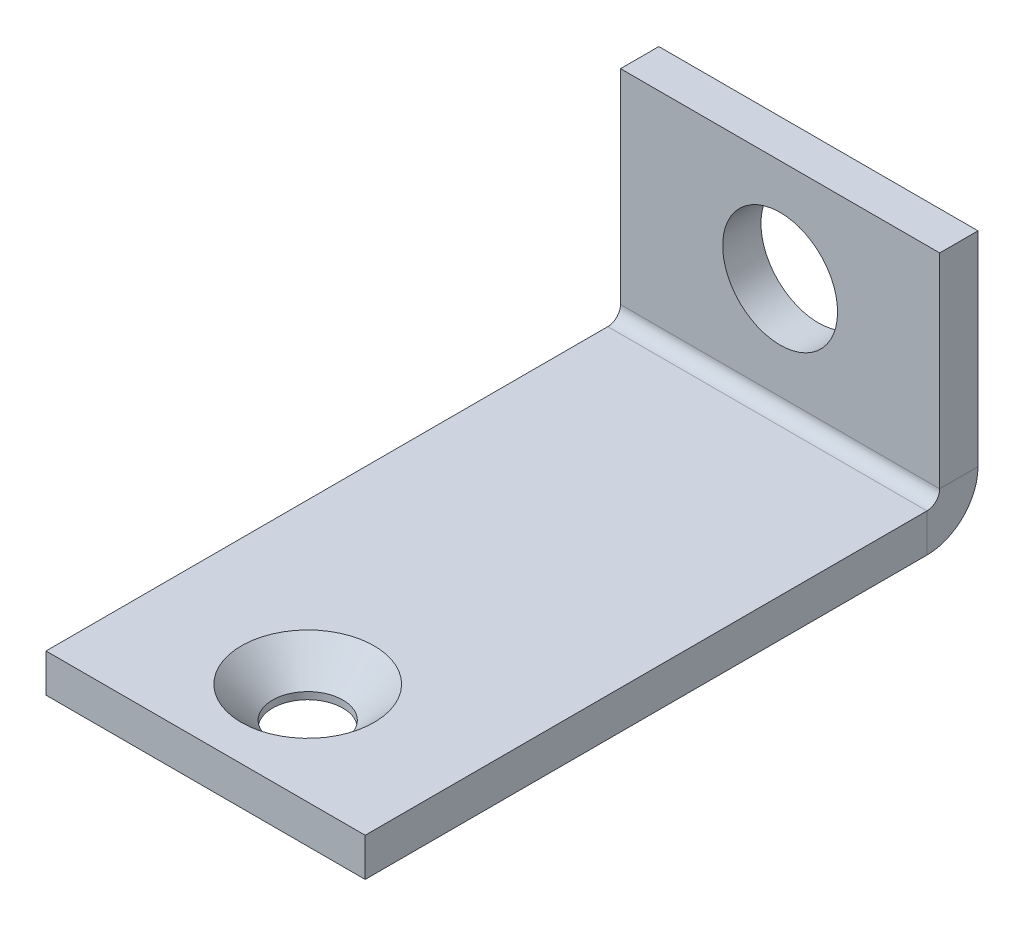
ISO-10303-21;
HEADER;
FILE_DESCRIPTION(('STEP AP214'),'2;1');
FILE_NAME('part.step','',(''),(''),'','','');
FILE_SCHEMA(('AUTOMOTIVE_DESIGN { 1 0 10303 214 1 1 1 1 }'));
ENDSEC;
DATA;
#1=APPLICATION_CONTEXT('core data for automotive mechanical design processes');
#2=APPLICATION_PROTOCOL_DEFINITION('international standard','automotive_design',2000,#1);
#3=PRODUCT_CONTEXT('',#1,'mechanical');
#4=PRODUCT('Part','Part','',(#3));
#5=PRODUCT_RELATED_PRODUCT_CATEGORY('part','',(#4));
#6=PRODUCT_DEFINITION_FORMATION('','',#4);
#7=PRODUCT_DEFINITION_CONTEXT('part definition',#1,'design');
#8=PRODUCT_DEFINITION('design','',#6,#7);
#9=PRODUCT_DEFINITION_SHAPE('','',#8);
#10=(LENGTH_UNIT() NAMED_UNIT(*) SI_UNIT(.MILLI.,.METRE.));
#11=(NAMED_UNIT(*) PLANE_ANGLE_UNIT() SI_UNIT($,.RADIAN.));
#12=(NAMED_UNIT(*) SI_UNIT($,.STERADIAN.) SOLID_ANGLE_UNIT());
#13=UNCERTAINTY_MEASURE_WITH_UNIT(LENGTH_MEASURE(1.E-05),#10,'distance_accuracy_value','');
#14=(GEOMETRIC_REPRESENTATION_CONTEXT(3) GLOBAL_UNCERTAINTY_ASSIGNED_CONTEXT((#13)) GLOBAL_UNIT_ASSIGNED_CONTEXT((#10,
#11,#12)) REPRESENTATION_CONTEXT('',''));
#15=CARTESIAN_POINT('',(0.,0.,0.));
#16=DIRECTION('',(0.,0.,1.));
#17=DIRECTION('',(1.,0.,0.));
#18=AXIS2_PLACEMENT_3D('',#15,#16,#17);
#19=CARTESIAN_POINT('',(25.,0.,4.));
#20=DIRECTION('',(1.,0.,0.));
#21=DIRECTION('',(0.,0.,-1.));
#22=AXIS2_PLACEMENT_3D('',#19,#20,#21);
#23=PLANE('',#22);
#24=DIRECTION('',(0.,1.,0.));
#25=VECTOR('',#24,1.);
#26=CARTESIAN_POINT('',(25.,0.,4.));
#27=LINE('',#26,#25);
#28=CARTESIAN_POINT('',(25.,0.,4.));
#29=VERTEX_POINT('',#28);
#30=CARTESIAN_POINT('',(25.,3.,4.));
#31=VERTEX_POINT('',#30);
#32=EDGE_CURVE('E13',#29,#31,#27,.T.);
#33=ORIENTED_EDGE('',*,*,#32,.F.);
#34=CARTESIAN_POINT('',(25.,4.,4.));
#35=DIRECTION('',(-1.,0.,0.));
#36=DIRECTION('',(0.,0.,1.));
#37=AXIS2_PLACEMENT_3D('',#34,#35,#36);
#38=CIRCLE('',#37,4.);
#39=CARTESIAN_POINT('',(25.,4.,0.));
#40=VERTEX_POINT('',#39);
#41=EDGE_CURVE('E140',#29,#40,#38,.F.);
#42=ORIENTED_EDGE('',*,*,#41,.T.);
#43=DIRECTION('',(0.,0.,-1.));
#44=VECTOR('',#43,1.);
#45=CARTESIAN_POINT('',(25.,4.,3.));
#46=LINE('',#45,#44);
#47=CARTESIAN_POINT('',(25.,4.,3.));
#48=VERTEX_POINT('',#47);
#49=EDGE_CURVE('E58',#48,#40,#46,.T.);
#50=ORIENTED_EDGE('',*,*,#49,.F.);
#51=CARTESIAN_POINT('',(25.,4.,4.));
#52=DIRECTION('',(1.,0.,0.));
#53=DIRECTION('',(0.,0.,-1.));
#54=AXIS2_PLACEMENT_3D('',#51,#52,#53);
#55=CIRCLE('',#54,1.);
#56=EDGE_CURVE('E147',#31,#48,#55,.T.);
#57=ORIENTED_EDGE('',*,*,#56,.F.);
#58=EDGE_LOOP('',(#33,#42,#50,#57));
#59=FACE_BOUND('',#58,.T.);
#60=ADVANCED_FACE('F50',(#59),#23,.T.);
#61=CARTESIAN_POINT('',(25.,4.,3.));
#62=DIRECTION('',(1.,0.,0.));
#63=DIRECTION('',(0.,0.,-1.));
#64=AXIS2_PLACEMENT_3D('',#61,#62,#63);
#65=PLANE('',#64);
#66=DIRECTION('',(0.,0.,-1.));
#67=VECTOR('',#66,1.);
#68=CARTESIAN_POINT('',(25.,0.,0.));
#69=LINE('',#68,#67);
#70=CARTESIAN_POINT('',(25.,0.,48.));
#71=VERTEX_POINT('',#70);
#72=EDGE_CURVE('E135',#71,#29,#69,.T.);
#73=ORIENTED_EDGE('',*,*,#72,.T.);
#74=ORIENTED_EDGE('',*,*,#32,.T.);
#75=DIRECTION('',(0.,0.,-1.));
#76=VECTOR('',#75,1.);
#77=CARTESIAN_POINT('',(25.,3.,0.));
#78=LINE('',#77,#76);
#79=CARTESIAN_POINT('',(25.,2.99999999999998,48.));
#80=VERTEX_POINT('',#79);
#81=EDGE_CURVE('E145',#80,#31,#78,.T.);
#82=ORIENTED_EDGE('',*,*,#81,.F.);
#83=DIRECTION('',(0.,1.,0.));
#84=VECTOR('',#83,1.);
#85=CARTESIAN_POINT('',(25.,0.,48.));
#86=LINE('',#85,#84);
#87=EDGE_CURVE('E126',#71,#80,#86,.T.);
#88=ORIENTED_EDGE('',*,*,#87,.F.);
#89=EDGE_LOOP('',(#73,#74,#82,#88));
#90=FACE_BOUND('',#89,.T.);
#91=ADVANCED_FACE('F143',(#90),#65,.T.);
#92=CARTESIAN_POINT('',(0.,4.,0.));
#93=DIRECTION('',(-1.,0.,0.));
#94=DIRECTION('',(0.,0.,1.));
#95=AXIS2_PLACEMENT_3D('',#92,#93,#94);
#96=PLANE('',#95);
#97=DIRECTION('',(0.,0.,1.));
#98=VECTOR('',#97,1.);
#99=CARTESIAN_POINT('',(0.,4.,0.));
#100=LINE('',#99,#98);
#101=CARTESIAN_POINT('',(0.,4.,0.));
#102=VERTEX_POINT('',#101);
#103=CARTESIAN_POINT('',(0.,4.,3.));
#104=VERTEX_POINT('',#103);
#105=EDGE_CURVE('E101',#102,#104,#100,.T.);
#106=ORIENTED_EDGE('',*,*,#105,.F.);
#107=CARTESIAN_POINT('',(0.,4.,4.));
#108=DIRECTION('',(-1.,0.,0.));
#109=DIRECTION('',(0.,0.,1.));
#110=AXIS2_PLACEMENT_3D('',#107,#108,#109);
#111=CIRCLE('',#110,4.);
#112=CARTESIAN_POINT('',(0.,0.,4.));
#113=VERTEX_POINT('',#112);
#114=EDGE_CURVE('E170',#113,#102,#111,.F.);
#115=ORIENTED_EDGE('',*,*,#114,.F.);
#116=DIRECTION('',(0.,-1.,0.));
#117=VECTOR('',#116,1.);
#118=CARTESIAN_POINT('',(0.,3.,4.));
#119=LINE('',#118,#117);
#120=CARTESIAN_POINT('',(0.,3.,4.));
#121=VERTEX_POINT('',#120);
#122=EDGE_CURVE('E94',#121,#113,#119,.T.);
#123=ORIENTED_EDGE('',*,*,#122,.F.);
#124=CARTESIAN_POINT('',(0.,4.,4.));
#125=DIRECTION('',(1.,0.,0.));
#126=DIRECTION('',(0.,0.,-1.));
#127=AXIS2_PLACEMENT_3D('',#124,#125,#126);
#128=CIRCLE('',#127,1.);
#129=EDGE_CURVE('E163',#121,#104,#128,.T.);
#130=ORIENTED_EDGE('',*,*,#129,.T.);
#131=EDGE_LOOP('',(#106,#115,#123,#130));
#132=FACE_BOUND('',#131,.T.);
#133=ADVANCED_FACE('F202',(#132),#96,.T.);
#134=CARTESIAN_POINT('',(0.,3.,4.));
#135=DIRECTION('',(-1.,0.,0.));
#136=DIRECTION('',(0.,0.,1.));
#137=AXIS2_PLACEMENT_3D('',#134,#135,#136);
#138=PLANE('',#137);
#139=DIRECTION('',(0.,1.,0.));
#140=VECTOR('',#139,1.);
#141=CARTESIAN_POINT('',(0.,0.,0.));
#142=LINE('',#141,#140);
#143=CARTESIAN_POINT('',(0.,20.,0.));
#144=VERTEX_POINT('',#143);
#145=EDGE_CURVE('E153',#102,#144,#142,.T.);
#146=ORIENTED_EDGE('',*,*,#145,.F.);
#147=ORIENTED_EDGE('',*,*,#105,.T.);
#148=DIRECTION('',(0.,1.,0.));
#149=VECTOR('',#148,1.);
#150=CARTESIAN_POINT('',(0.,0.,3.));
#151=LINE('',#150,#149);
#152=CARTESIAN_POINT('',(0.,20.,3.));
#153=VERTEX_POINT('',#152);
#154=EDGE_CURVE('E160',#104,#153,#151,.T.);
#155=ORIENTED_EDGE('',*,*,#154,.T.);
#156=DIRECTION('',(0.,0.,-1.));
#157=VECTOR('',#156,1.);
#158=CARTESIAN_POINT('',(0.,20.,3.));
#159=LINE('',#158,#157);
#160=EDGE_CURVE('E156',#153,#144,#159,.T.);
#161=ORIENTED_EDGE('',*,*,#160,.T.);
#162=EDGE_LOOP('',(#146,#147,#155,#161));
#163=FACE_BOUND('',#162,.T.);
#164=ADVANCED_FACE('F189',(#163),#138,.T.);
#165=CARTESIAN_POINT('',(25.,0.,0.));
#166=DIRECTION('',(0.,0.,1.));
#167=DIRECTION('',(1.,0.,0.));
#168=AXIS2_PLACEMENT_3D('',#165,#166,#167);
#169=PLANE('',#168);
#170=CARTESIAN_POINT('',(12.5,12.,0.));
#171=DIRECTION('',(0.,0.,1.));
#172=DIRECTION('',(1.,0.,0.));
#173=AXIS2_PLACEMENT_3D('',#170,#171,#172);
#174=CIRCLE('',#173,4.5);
#175=CARTESIAN_POINT('',(17.,12.,0.));
#176=VERTEX_POINT('',#175);
#177=EDGE_CURVE('E222',#176,#176,#174,.T.);
#178=ORIENTED_EDGE('',*,*,#177,.T.);
#179=EDGE_LOOP('',(#178));
#180=FACE_BOUND('',#179,.T.);
#181=ORIENTED_EDGE('',*,*,#145,.T.);
#182=DIRECTION('',(-1.,0.,0.));
#183=VECTOR('',#182,1.);
#184=CARTESIAN_POINT('',(25.,20.,0.));
#185=LINE('',#184,#183);
#186=CARTESIAN_POINT('',(25.,20.,0.));
#187=VERTEX_POINT('',#186);
#188=EDGE_CURVE('E184',#187,#144,#185,.T.);
#189=ORIENTED_EDGE('',*,*,#188,.F.);
#190=DIRECTION('',(0.,1.,0.));
#191=VECTOR('',#190,1.);
#192=CARTESIAN_POINT('',(25.,0.,0.));
#193=LINE('',#192,#191);
#194=EDGE_CURVE('E107',#40,#187,#193,.T.);
#195=ORIENTED_EDGE('',*,*,#194,.F.);
#196=DIRECTION('',(-1.,0.,0.));
#197=VECTOR('',#196,1.);
#198=CARTESIAN_POINT('',(25.,4.,0.));
#199=LINE('',#198,#197);
#200=EDGE_CURVE('E152',#40,#102,#199,.T.);
#201=ORIENTED_EDGE('',*,*,#200,.T.);
#202=EDGE_LOOP('',(#181,#189,#195,#201));
#203=FACE_BOUND('',#202,.T.);
#204=ADVANCED_FACE('F239',(#180,#203),#169,.F.);
#205=CARTESIAN_POINT('',(25.,20.,3.));
#206=DIRECTION('',(0.,1.,0.));
#207=DIRECTION('',(0.,0.,1.));
#208=AXIS2_PLACEMENT_3D('',#205,#206,#207);
#209=PLANE('',#208);
#210=ORIENTED_EDGE('',*,*,#160,.F.);
#211=DIRECTION('',(-1.,0.,0.));
#212=VECTOR('',#211,1.);
#213=CARTESIAN_POINT('',(25.,20.,3.));
#214=LINE('',#213,#212);
#215=CARTESIAN_POINT('',(25.,20.,3.));
#216=VERTEX_POINT('',#215);
#217=EDGE_CURVE('E182',#216,#153,#214,.T.);
#218=ORIENTED_EDGE('',*,*,#217,.F.);
#219=DIRECTION('',(0.,0.,-1.));
#220=VECTOR('',#219,1.);
#221=CARTESIAN_POINT('',(25.,20.,3.));
#222=LINE('',#221,#220);
#223=EDGE_CURVE('E208',#216,#187,#222,.T.);
#224=ORIENTED_EDGE('',*,*,#223,.T.);
#225=ORIENTED_EDGE('',*,*,#188,.T.);
#226=EDGE_LOOP('',(#210,#218,#224,#225));
#227=FACE_BOUND('',#226,.T.);
#228=ADVANCED_FACE('F232',(#227),#209,.T.);
#229=CARTESIAN_POINT('',(25.,0.,3.));
#230=DIRECTION('',(0.,0.,1.));
#231=DIRECTION('',(1.,0.,0.));
#232=AXIS2_PLACEMENT_3D('',#229,#230,#231);
#233=PLANE('',#232);
#234=CARTESIAN_POINT('',(12.5,12.,3.));
#235=DIRECTION('',(0.,0.,1.));
#236=DIRECTION('',(1.,0.,0.));
#237=AXIS2_PLACEMENT_3D('',#234,#235,#236);
#238=CIRCLE('',#237,4.5);
#239=CARTESIAN_POINT('',(17.,12.,3.));
#240=VERTEX_POINT('',#239);
#241=EDGE_CURVE('E225',#240,#240,#238,.T.);
#242=ORIENTED_EDGE('',*,*,#241,.F.);
#243=EDGE_LOOP('',(#242));
#244=FACE_BOUND('',#243,.T.);
#245=ORIENTED_EDGE('',*,*,#154,.F.);
#246=DIRECTION('',(-1.,0.,0.));
#247=VECTOR('',#246,1.);
#248=CARTESIAN_POINT('',(25.,4.,3.));
#249=LINE('',#248,#247);
#250=EDGE_CURVE('E179',#48,#104,#249,.T.);
#251=ORIENTED_EDGE('',*,*,#250,.F.);
#252=DIRECTION('',(0.,1.,0.));
#253=VECTOR('',#252,1.);
#254=CARTESIAN_POINT('',(25.,0.,3.));
#255=LINE('',#254,#253);
#256=EDGE_CURVE('E207',#48,#216,#255,.T.);
#257=ORIENTED_EDGE('',*,*,#256,.T.);
#258=ORIENTED_EDGE('',*,*,#217,.T.);
#259=EDGE_LOOP('',(#245,#251,#257,#258));
#260=FACE_BOUND('',#259,.T.);
#261=ADVANCED_FACE('F200',(#244,#260),#233,.T.);
#262=CARTESIAN_POINT('',(25.,4.,4.));
#263=DIRECTION('',(-1.,0.,0.));
#264=DIRECTION('',(0.,0.,1.));
#265=AXIS2_PLACEMENT_3D('',#262,#263,#264);
#266=CYLINDRICAL_SURFACE('',#265,1.);
#267=ORIENTED_EDGE('',*,*,#129,.F.);
#268=DIRECTION('',(-1.,0.,0.));
#269=VECTOR('',#268,1.);
#270=CARTESIAN_POINT('',(25.,3.,4.));
#271=LINE('',#270,#269);
#272=EDGE_CURVE('E176',#31,#121,#271,.T.);
#273=ORIENTED_EDGE('',*,*,#272,.F.);
#274=ORIENTED_EDGE('',*,*,#56,.T.);
#275=ORIENTED_EDGE('',*,*,#250,.T.);
#276=EDGE_LOOP('',(#267,#273,#274,#275));
#277=FACE_BOUND('',#276,.T.);
#278=ADVANCED_FACE('F195',(#277),#266,.F.);
#279=CARTESIAN_POINT('',(25.,3.,0.));
#280=DIRECTION('',(0.,1.,0.));
#281=DIRECTION('',(0.,0.,1.));
#282=AXIS2_PLACEMENT_3D('',#279,#280,#281);
#283=PLANE('',#282);
#284=CARTESIAN_POINT('',(12.5,3.,40.));
#285=DIRECTION('',(0.,1.,0.));
#286=DIRECTION('',(0.,0.,1.));
#287=AXIS2_PLACEMENT_3D('',#284,#285,#286);
#288=CIRCLE('',#287,5.2);
#289=CARTESIAN_POINT('',(12.5,3.,45.2));
#290=VERTEX_POINT('',#289);
#291=EDGE_CURVE('E219',#290,#290,#288,.T.);
#292=ORIENTED_EDGE('',*,*,#291,.F.);
#293=EDGE_LOOP('',(#292));
#294=FACE_BOUND('',#293,.T.);
#295=DIRECTION('',(0.,0.,-1.));
#296=VECTOR('',#295,1.);
#297=CARTESIAN_POINT('',(0.,3.,0.));
#298=LINE('',#297,#296);
#299=CARTESIAN_POINT('',(0.,2.99999999999998,48.));
#300=VERTEX_POINT('',#299);
#301=EDGE_CURVE('E165',#300,#121,#298,.T.);
#302=ORIENTED_EDGE('',*,*,#301,.F.);
#303=DIRECTION('',(-1.,0.,0.));
#304=VECTOR('',#303,1.);
#305=CARTESIAN_POINT('',(25.,2.99999999999998,48.));
#306=LINE('',#305,#304);
#307=EDGE_CURVE('E130',#80,#300,#306,.T.);
#308=ORIENTED_EDGE('',*,*,#307,.F.);
#309=ORIENTED_EDGE('',*,*,#81,.T.);
#310=ORIENTED_EDGE('',*,*,#272,.T.);
#311=EDGE_LOOP('',(#302,#308,#309,#310));
#312=FACE_BOUND('',#311,.T.);
#313=ADVANCED_FACE('F205',(#294,#312),#283,.T.);
#314=CARTESIAN_POINT('',(25.,0.,48.));
#315=DIRECTION('',(0.,0.,1.));
#316=DIRECTION('',(1.,0.,0.));
#317=AXIS2_PLACEMENT_3D('',#314,#315,#316);
#318=PLANE('',#317);
#319=DIRECTION('',(0.,1.,0.));
#320=VECTOR('',#319,1.);
#321=CARTESIAN_POINT('',(0.,0.,48.));
#322=LINE('',#321,#320);
#323=CARTESIAN_POINT('',(0.,0.,48.));
#324=VERTEX_POINT('',#323);
#325=EDGE_CURVE('E128',#324,#300,#322,.T.);
#326=ORIENTED_EDGE('',*,*,#325,.F.);
#327=DIRECTION('',(-1.,0.,0.));
#328=VECTOR('',#327,1.);
#329=CARTESIAN_POINT('',(25.,0.,48.));
#330=LINE('',#329,#328);
#331=EDGE_CURVE('E122',#71,#324,#330,.T.);
#332=ORIENTED_EDGE('',*,*,#331,.F.);
#333=ORIENTED_EDGE('',*,*,#87,.T.);
#334=ORIENTED_EDGE('',*,*,#307,.T.);
#335=EDGE_LOOP('',(#326,#332,#333,#334));
#336=FACE_BOUND('',#335,.T.);
#337=ADVANCED_FACE('F124',(#336),#318,.T.);
#338=CARTESIAN_POINT('',(25.,0.,0.));
#339=DIRECTION('',(0.,1.,0.));
#340=DIRECTION('',(0.,0.,1.));
#341=AXIS2_PLACEMENT_3D('',#338,#339,#340);
#342=PLANE('',#341);
#343=CARTESIAN_POINT('',(12.5,0.,40.));
#344=DIRECTION('',(0.,1.,0.));
#345=DIRECTION('',(0.,0.,1.));
#346=AXIS2_PLACEMENT_3D('',#343,#344,#345);
#347=CIRCLE('',#346,2.75);
#348=CARTESIAN_POINT('',(12.5,0.,42.75));
#349=VERTEX_POINT('',#348);
#350=EDGE_CURVE('E157',#349,#349,#347,.T.);
#351=ORIENTED_EDGE('',*,*,#350,.T.);
#352=EDGE_LOOP('',(#351));
#353=FACE_BOUND('',#352,.T.);
#354=DIRECTION('',(0.,0.,-1.));
#355=VECTOR('',#354,1.);
#356=CARTESIAN_POINT('',(0.,0.,0.));
#357=LINE('',#356,#355);
#358=EDGE_CURVE('E168',#324,#113,#357,.T.);
#359=ORIENTED_EDGE('',*,*,#358,.T.);
#360=DIRECTION('',(-1.,0.,0.));
#361=VECTOR('',#360,1.);
#362=CARTESIAN_POINT('',(25.,0.,4.));
#363=LINE('',#362,#361);
#364=EDGE_CURVE('E131',#29,#113,#363,.T.);
#365=ORIENTED_EDGE('',*,*,#364,.F.);
#366=ORIENTED_EDGE('',*,*,#72,.F.);
#367=ORIENTED_EDGE('',*,*,#331,.T.);
#368=EDGE_LOOP('',(#359,#365,#366,#367));
#369=FACE_BOUND('',#368,.T.);
#370=ADVANCED_FACE('F136',(#353,#369),#342,.F.);
#371=CARTESIAN_POINT('',(25.,4.,4.));
#372=DIRECTION('',(-1.,0.,0.));
#373=DIRECTION('',(0.,0.,1.));
#374=AXIS2_PLACEMENT_3D('',#371,#372,#373);
#375=CYLINDRICAL_SURFACE('',#374,4.);
#376=ORIENTED_EDGE('',*,*,#114,.T.);
#377=ORIENTED_EDGE('',*,*,#200,.F.);
#378=ORIENTED_EDGE('',*,*,#41,.F.);
#379=ORIENTED_EDGE('',*,*,#364,.T.);
#380=EDGE_LOOP('',(#376,#377,#378,#379));
#381=FACE_BOUND('',#380,.T.);
#382=ADVANCED_FACE('F263',(#381),#375,.T.);
#383=CARTESIAN_POINT('',(25.,4.,4.));
#384=DIRECTION('',(1.,0.,0.));
#385=DIRECTION('',(0.,0.,-1.));
#386=AXIS2_PLACEMENT_3D('',#383,#384,#385);
#387=PLANE('',#386);
#388=ORIENTED_EDGE('',*,*,#194,.T.);
#389=ORIENTED_EDGE('',*,*,#223,.F.);
#390=ORIENTED_EDGE('',*,*,#256,.F.);
#391=ORIENTED_EDGE('',*,*,#49,.T.);
#392=EDGE_LOOP('',(#388,#389,#390,#391));
#393=FACE_BOUND('',#392,.T.);
#394=ADVANCED_FACE('F260',(#393),#387,.T.);
#395=CARTESIAN_POINT('',(0.,4.,4.));
#396=DIRECTION('',(1.,0.,0.));
#397=DIRECTION('',(0.,0.,-1.));
#398=AXIS2_PLACEMENT_3D('',#395,#396,#397);
#399=PLANE('',#398);
#400=ORIENTED_EDGE('',*,*,#301,.T.);
#401=ORIENTED_EDGE('',*,*,#122,.T.);
#402=ORIENTED_EDGE('',*,*,#358,.F.);
#403=ORIENTED_EDGE('',*,*,#325,.T.);
#404=EDGE_LOOP('',(#400,#401,#402,#403));
#405=FACE_BOUND('',#404,.T.);
#406=ADVANCED_FACE('F262',(#405),#399,.F.);
#407=CARTESIAN_POINT('',(12.5,3.,40.));
#408=DIRECTION('',(0.,1.,0.));
#409=DIRECTION('',(0.,0.,1.));
#410=AXIS2_PLACEMENT_3D('',#407,#408,#409);
#411=CYLINDRICAL_SURFACE('',#410,2.75);
#412=ORIENTED_EDGE('',*,*,#350,.F.);
#413=EDGE_LOOP('',(#412));
#414=FACE_BOUND('',#413,.T.);
#415=CARTESIAN_POINT('',(12.5,0.549999999999995,40.));
#416=DIRECTION('',(0.,1.,0.));
#417=DIRECTION('',(0.,0.,1.));
#418=AXIS2_PLACEMENT_3D('',#415,#416,#417);
#419=CIRCLE('',#418,2.75);
#420=CARTESIAN_POINT('',(12.5,0.549999999999995,42.75));
#421=VERTEX_POINT('',#420);
#422=EDGE_CURVE('E216',#421,#421,#419,.T.);
#423=ORIENTED_EDGE('',*,*,#422,.T.);
#424=EDGE_LOOP('',(#423));
#425=FACE_BOUND('',#424,.T.);
#426=ADVANCED_FACE('F269',(#414,#425),#411,.F.);
#427=CARTESIAN_POINT('',(12.5,3.,40.));
#428=DIRECTION('',(0.,1.,0.));
#429=DIRECTION('',(0.,0.,1.));
#430=AXIS2_PLACEMENT_3D('',#427,#428,#429);
#431=CONICAL_SURFACE('',#430,5.2,0.785398163397448);
#432=ORIENTED_EDGE('',*,*,#422,.F.);
#433=EDGE_LOOP('',(#432));
#434=FACE_BOUND('',#433,.T.);
#435=ORIENTED_EDGE('',*,*,#291,.T.);
#436=EDGE_LOOP('',(#435));
#437=FACE_BOUND('',#436,.T.);
#438=ADVANCED_FACE('F287',(#434,#437),#431,.F.);
#439=CARTESIAN_POINT('',(12.5,12.,3.));
#440=DIRECTION('',(0.,0.,1.));
#441=DIRECTION('',(1.,0.,0.));
#442=AXIS2_PLACEMENT_3D('',#439,#440,#441);
#443=CYLINDRICAL_SURFACE('',#442,4.5);
#444=ORIENTED_EDGE('',*,*,#177,.F.);
#445=EDGE_LOOP('',(#444));
#446=FACE_BOUND('',#445,.T.);
#447=ORIENTED_EDGE('',*,*,#241,.T.);
#448=EDGE_LOOP('',(#447));
#449=FACE_BOUND('',#448,.T.);
#450=ADVANCED_FACE('F229',(#446,#449),#443,.F.);
#451=CLOSED_SHELL('',(#60,#91,#133,#164,#204,#228,#261,#278,#313,#337,#370,#382,#394,#406,#426,
#438,#450));
#452=MANIFOLD_SOLID_BREP('B2',#451);
#453=ADVANCED_BREP_SHAPE_REPRESENTATION('',(#18,#452),#14);
#454=SHAPE_DEFINITION_REPRESENTATION(#9,#453);
ENDSEC;
END-ISO-10303-21;
